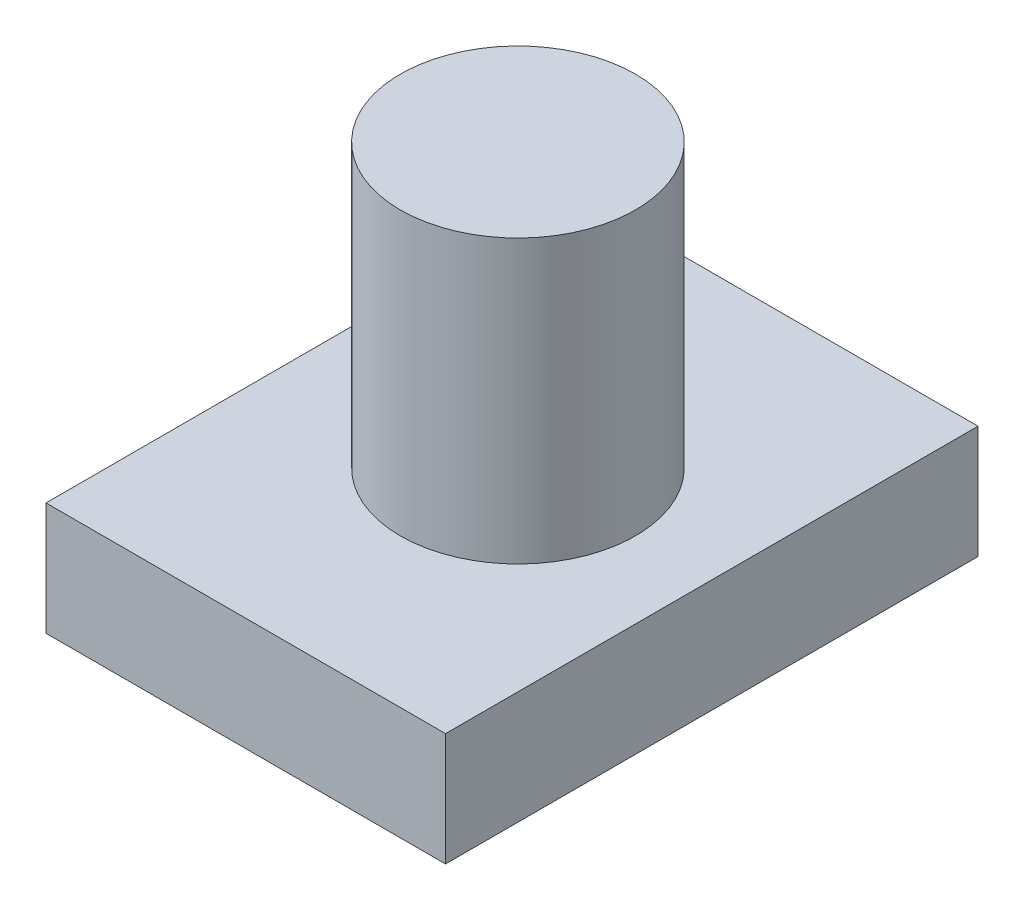
ISO-10303-21;
HEADER;
FILE_DESCRIPTION(('STEP AP214'),'2;1');
FILE_NAME('part.step','',(''),(''),'','','');
FILE_SCHEMA(('AUTOMOTIVE_DESIGN { 1 0 10303 214 1 1 1 1 }'));
ENDSEC;
DATA;
#1=APPLICATION_CONTEXT('core data for automotive mechanical design processes');
#2=APPLICATION_PROTOCOL_DEFINITION('international standard','automotive_design',2000,#1);
#3=PRODUCT_CONTEXT('',#1,'mechanical');
#4=PRODUCT('Part','Part','',(#3));
#5=PRODUCT_RELATED_PRODUCT_CATEGORY('part','',(#4));
#6=PRODUCT_DEFINITION_FORMATION('','',#4);
#7=PRODUCT_DEFINITION_CONTEXT('part definition',#1,'design');
#8=PRODUCT_DEFINITION('design','',#6,#7);
#9=PRODUCT_DEFINITION_SHAPE('','',#8);
#10=(LENGTH_UNIT() NAMED_UNIT(*) SI_UNIT(.MILLI.,.METRE.));
#11=(NAMED_UNIT(*) PLANE_ANGLE_UNIT() SI_UNIT($,.RADIAN.));
#12=(NAMED_UNIT(*) SI_UNIT($,.STERADIAN.) SOLID_ANGLE_UNIT());
#13=UNCERTAINTY_MEASURE_WITH_UNIT(LENGTH_MEASURE(1.E-05),#10,'distance_accuracy_value','');
#14=(GEOMETRIC_REPRESENTATION_CONTEXT(3) GLOBAL_UNCERTAINTY_ASSIGNED_CONTEXT((#13)) GLOBAL_UNIT_ASSIGNED_CONTEXT((#10,
#11,#12)) REPRESENTATION_CONTEXT('',''));
#15=CARTESIAN_POINT('',(0.,0.,0.));
#16=DIRECTION('',(0.,0.,1.));
#17=DIRECTION('',(1.,0.,0.));
#18=AXIS2_PLACEMENT_3D('',#15,#16,#17);
#19=CARTESIAN_POINT('',(0.,30.,0.));
#20=DIRECTION('',(0.,-1.,0.));
#21=DIRECTION('',(0.,0.,-1.));
#22=AXIS2_PLACEMENT_3D('',#19,#20,#21);
#23=CYLINDRICAL_SURFACE('',#22,12.5);
#24=CARTESIAN_POINT('',(0.,30.,0.));
#25=DIRECTION('',(0.,1.,0.));
#26=DIRECTION('',(0.,0.,1.));
#27=AXIS2_PLACEMENT_3D('',#24,#25,#26);
#28=CIRCLE('',#27,12.5);
#29=CARTESIAN_POINT('',(0.,30.,12.5));
#30=VERTEX_POINT('',#29);
#31=EDGE_CURVE('E11',#30,#30,#28,.T.);
#32=ORIENTED_EDGE('',*,*,#31,.F.);
#33=EDGE_LOOP('',(#32));
#34=FACE_BOUND('',#33,.T.);
#35=CARTESIAN_POINT('',(0.,0.,0.));
#36=DIRECTION('',(0.,1.,0.));
#37=DIRECTION('',(0.,0.,1.));
#38=AXIS2_PLACEMENT_3D('',#35,#36,#37);
#39=CIRCLE('',#38,12.5);
#40=CARTESIAN_POINT('',(0.,0.,12.5));
#41=VERTEX_POINT('',#40);
#42=EDGE_CURVE('E39',#41,#41,#39,.T.);
#43=ORIENTED_EDGE('',*,*,#42,.T.);
#44=EDGE_LOOP('',(#43));
#45=FACE_BOUND('',#44,.T.);
#46=ADVANCED_FACE('F31',(#34,#45),#23,.T.);
#47=CARTESIAN_POINT('',(0.,30.,0.));
#48=DIRECTION('',(0.,1.,0.));
#49=DIRECTION('',(0.,0.,1.));
#50=AXIS2_PLACEMENT_3D('',#47,#48,#49);
#51=PLANE('',#50);
#52=ORIENTED_EDGE('',*,*,#31,.T.);
#53=EDGE_LOOP('',(#52));
#54=FACE_BOUND('',#53,.T.);
#55=ADVANCED_FACE('F113',(#54),#51,.T.);
#56=CARTESIAN_POINT('',(20.6033999924512,0.,28.2931070890254));
#57=DIRECTION('',(0.,1.,0.));
#58=DIRECTION('',(0.,0.,1.));
#59=AXIS2_PLACEMENT_3D('',#56,#57,#58);
#60=PLANE('',#59);
#61=DIRECTION('',(0.,0.,1.));
#62=VECTOR('',#61,1.);
#63=CARTESIAN_POINT('',(20.6033999924512,0.,-28.2931070890254));
#64=LINE('',#63,#62);
#65=CARTESIAN_POINT('',(20.6033999924512,0.,-28.2931070890254));
#66=VERTEX_POINT('',#65);
#67=CARTESIAN_POINT('',(20.6033999924512,0.,28.2931070890254));
#68=VERTEX_POINT('',#67);
#69=EDGE_CURVE('E98',#66,#68,#64,.T.);
#70=ORIENTED_EDGE('',*,*,#69,.F.);
#71=DIRECTION('',(1.,0.,0.));
#72=VECTOR('',#71,1.);
#73=CARTESIAN_POINT('',(-21.858345154222,0.,-28.2931070890254));
#74=LINE('',#73,#72);
#75=CARTESIAN_POINT('',(-21.858345154222,0.,-28.2931070890254));
#76=VERTEX_POINT('',#75);
#77=EDGE_CURVE('E70',#76,#66,#74,.T.);
#78=ORIENTED_EDGE('',*,*,#77,.F.);
#79=DIRECTION('',(0.,0.,-1.));
#80=VECTOR('',#79,1.);
#81=CARTESIAN_POINT('',(-21.858345154222,0.,-28.2931070890254));
#82=LINE('',#81,#80);
#83=CARTESIAN_POINT('',(-21.858345154222,0.,28.2931070890254));
#84=VERTEX_POINT('',#83);
#85=EDGE_CURVE('E64',#84,#76,#82,.T.);
#86=ORIENTED_EDGE('',*,*,#85,.F.);
#87=DIRECTION('',(-1.,0.,0.));
#88=VECTOR('',#87,1.);
#89=CARTESIAN_POINT('',(-21.858345154222,0.,28.2931070890254));
#90=LINE('',#89,#88);
#91=EDGE_CURVE('E88',#68,#84,#90,.T.);
#92=ORIENTED_EDGE('',*,*,#91,.F.);
#93=EDGE_LOOP('',(#70,#78,#86,#92));
#94=FACE_BOUND('',#93,.T.);
#95=ORIENTED_EDGE('',*,*,#42,.F.);
#96=EDGE_LOOP('',(#95));
#97=FACE_BOUND('',#96,.T.);
#98=ADVANCED_FACE('F110',(#94,#97),#60,.T.);
#99=CARTESIAN_POINT('',(20.6033999924512,-12.,-28.2931070890254));
#100=DIRECTION('',(-1.,0.,0.));
#101=DIRECTION('',(0.,0.,1.));
#102=AXIS2_PLACEMENT_3D('',#99,#100,#101);
#103=PLANE('',#102);
#104=ORIENTED_EDGE('',*,*,#69,.T.);
#105=DIRECTION('',(0.,1.,0.));
#106=VECTOR('',#105,1.);
#107=CARTESIAN_POINT('',(20.6033999924512,-12.,28.2931070890254));
#108=LINE('',#107,#106);
#109=CARTESIAN_POINT('',(20.6033999924512,-12.,28.2931070890254));
#110=VERTEX_POINT('',#109);
#111=EDGE_CURVE('E89',#110,#68,#108,.T.);
#112=ORIENTED_EDGE('',*,*,#111,.F.);
#113=DIRECTION('',(0.,0.,1.));
#114=VECTOR('',#113,1.);
#115=CARTESIAN_POINT('',(20.6033999924512,-12.,-28.2931070890254));
#116=LINE('',#115,#114);
#117=CARTESIAN_POINT('',(20.6033999924512,-12.,-28.2931070890254));
#118=VERTEX_POINT('',#117);
#119=EDGE_CURVE('E83',#118,#110,#116,.T.);
#120=ORIENTED_EDGE('',*,*,#119,.F.);
#121=DIRECTION('',(0.,1.,0.));
#122=VECTOR('',#121,1.);
#123=CARTESIAN_POINT('',(20.6033999924512,-12.,-28.2931070890254));
#124=LINE('',#123,#122);
#125=EDGE_CURVE('E94',#118,#66,#124,.T.);
#126=ORIENTED_EDGE('',*,*,#125,.T.);
#127=EDGE_LOOP('',(#104,#112,#120,#126));
#128=FACE_BOUND('',#127,.T.);
#129=ADVANCED_FACE('F112',(#128),#103,.F.);
#130=CARTESIAN_POINT('',(-21.858345154222,-12.,28.2931070890254));
#131=DIRECTION('',(0.,0.,-1.));
#132=DIRECTION('',(-1.,0.,0.));
#133=AXIS2_PLACEMENT_3D('',#130,#131,#132);
#134=PLANE('',#133);
#135=ORIENTED_EDGE('',*,*,#91,.T.);
#136=DIRECTION('',(0.,1.,0.));
#137=VECTOR('',#136,1.);
#138=CARTESIAN_POINT('',(-21.858345154222,-12.,28.2931070890254));
#139=LINE('',#138,#137);
#140=CARTESIAN_POINT('',(-21.858345154222,-12.,28.2931070890254));
#141=VERTEX_POINT('',#140);
#142=EDGE_CURVE('E86',#141,#84,#139,.T.);
#143=ORIENTED_EDGE('',*,*,#142,.F.);
#144=DIRECTION('',(-1.,0.,0.));
#145=VECTOR('',#144,1.);
#146=CARTESIAN_POINT('',(-21.858345154222,-12.,28.2931070890254));
#147=LINE('',#146,#145);
#148=EDGE_CURVE('E78',#110,#141,#147,.T.);
#149=ORIENTED_EDGE('',*,*,#148,.F.);
#150=ORIENTED_EDGE('',*,*,#111,.T.);
#151=EDGE_LOOP('',(#135,#143,#149,#150));
#152=FACE_BOUND('',#151,.T.);
#153=ADVANCED_FACE('F87',(#152),#134,.F.);
#154=CARTESIAN_POINT('',(-21.858345154222,-12.,-28.2931070890254));
#155=DIRECTION('',(1.,0.,0.));
#156=DIRECTION('',(0.,0.,-1.));
#157=AXIS2_PLACEMENT_3D('',#154,#155,#156);
#158=PLANE('',#157);
#159=ORIENTED_EDGE('',*,*,#85,.T.);
#160=DIRECTION('',(0.,1.,0.));
#161=VECTOR('',#160,1.);
#162=CARTESIAN_POINT('',(-21.858345154222,-12.,-28.2931070890254));
#163=LINE('',#162,#161);
#164=CARTESIAN_POINT('',(-21.858345154222,-12.,-28.2931070890254));
#165=VERTEX_POINT('',#164);
#166=EDGE_CURVE('E90',#165,#76,#163,.T.);
#167=ORIENTED_EDGE('',*,*,#166,.F.);
#168=DIRECTION('',(0.,0.,-1.));
#169=VECTOR('',#168,1.);
#170=CARTESIAN_POINT('',(-21.858345154222,-12.,-28.2931070890254));
#171=LINE('',#170,#169);
#172=EDGE_CURVE('E81',#141,#165,#171,.T.);
#173=ORIENTED_EDGE('',*,*,#172,.F.);
#174=ORIENTED_EDGE('',*,*,#142,.T.);
#175=EDGE_LOOP('',(#159,#167,#173,#174));
#176=FACE_BOUND('',#175,.T.);
#177=ADVANCED_FACE('F92',(#176),#158,.F.);
#178=CARTESIAN_POINT('',(-21.858345154222,-12.,-28.2931070890254));
#179=DIRECTION('',(0.,0.,1.));
#180=DIRECTION('',(1.,0.,0.));
#181=AXIS2_PLACEMENT_3D('',#178,#179,#180);
#182=PLANE('',#181);
#183=ORIENTED_EDGE('',*,*,#77,.T.);
#184=ORIENTED_EDGE('',*,*,#125,.F.);
#185=DIRECTION('',(1.,0.,0.));
#186=VECTOR('',#185,1.);
#187=CARTESIAN_POINT('',(-21.858345154222,-12.,-28.2931070890254));
#188=LINE('',#187,#186);
#189=EDGE_CURVE('E47',#165,#118,#188,.T.);
#190=ORIENTED_EDGE('',*,*,#189,.F.);
#191=ORIENTED_EDGE('',*,*,#166,.T.);
#192=EDGE_LOOP('',(#183,#184,#190,#191));
#193=FACE_BOUND('',#192,.T.);
#194=ADVANCED_FACE('F162',(#193),#182,.F.);
#195=CARTESIAN_POINT('',(20.6033999924512,-12.,28.2931070890254));
#196=DIRECTION('',(0.,1.,0.));
#197=DIRECTION('',(0.,0.,1.));
#198=AXIS2_PLACEMENT_3D('',#195,#196,#197);
#199=PLANE('',#198);
#200=ORIENTED_EDGE('',*,*,#119,.T.);
#201=ORIENTED_EDGE('',*,*,#148,.T.);
#202=ORIENTED_EDGE('',*,*,#172,.T.);
#203=ORIENTED_EDGE('',*,*,#189,.T.);
#204=EDGE_LOOP('',(#200,#201,#202,#203));
#205=FACE_BOUND('',#204,.T.);
#206=ADVANCED_FACE('F79',(#205),#199,.F.);
#207=CLOSED_SHELL('',(#46,#55,#98,#129,#153,#177,#194,#206));
#208=MANIFOLD_SOLID_BREP('B2',#207);
#209=ADVANCED_BREP_SHAPE_REPRESENTATION('',(#18,#208),#14);
#210=SHAPE_DEFINITION_REPRESENTATION(#9,#209);
ENDSEC;
END-ISO-10303-21;
